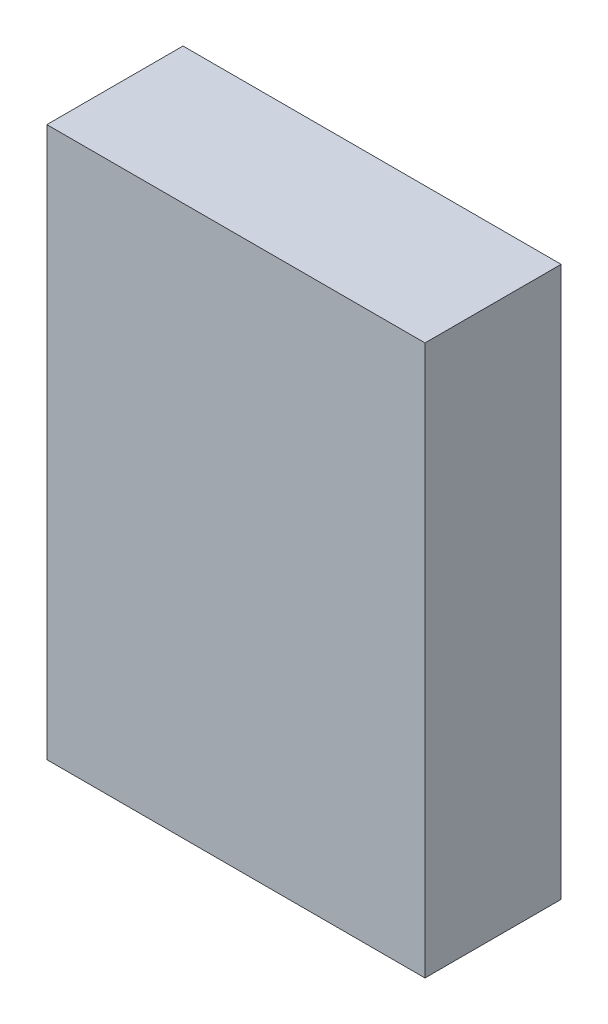
ISO-10303-21;
HEADER;
FILE_DESCRIPTION(('STEP AP214'),'2;1');
FILE_NAME('part.step','',(''),(''),'','','');
FILE_SCHEMA(('AUTOMOTIVE_DESIGN { 1 0 10303 214 1 1 1 1 }'));
ENDSEC;
DATA;
#1=APPLICATION_CONTEXT('core data for automotive mechanical design processes');
#2=APPLICATION_PROTOCOL_DEFINITION('international standard','automotive_design',2000,#1);
#3=PRODUCT_CONTEXT('',#1,'mechanical');
#4=PRODUCT('Part','Part','',(#3));
#5=PRODUCT_RELATED_PRODUCT_CATEGORY('part','',(#4));
#6=PRODUCT_DEFINITION_FORMATION('','',#4);
#7=PRODUCT_DEFINITION_CONTEXT('part definition',#1,'design');
#8=PRODUCT_DEFINITION('design','',#6,#7);
#9=PRODUCT_DEFINITION_SHAPE('','',#8);
#10=(LENGTH_UNIT() NAMED_UNIT(*) SI_UNIT(.MILLI.,.METRE.));
#11=(NAMED_UNIT(*) PLANE_ANGLE_UNIT() SI_UNIT($,.RADIAN.));
#12=(NAMED_UNIT(*) SI_UNIT($,.STERADIAN.) SOLID_ANGLE_UNIT());
#13=UNCERTAINTY_MEASURE_WITH_UNIT(LENGTH_MEASURE(1.E-05),#10,'distance_accuracy_value','');
#14=(GEOMETRIC_REPRESENTATION_CONTEXT(3) GLOBAL_UNCERTAINTY_ASSIGNED_CONTEXT((#13)) GLOBAL_UNIT_ASSIGNED_CONTEXT((#10,
#11,#12)) REPRESENTATION_CONTEXT('',''));
#15=CARTESIAN_POINT('',(0.,0.,0.));
#16=DIRECTION('',(0.,0.,1.));
#17=DIRECTION('',(1.,0.,0.));
#18=AXIS2_PLACEMENT_3D('',#15,#16,#17);
#19=CARTESIAN_POINT('',(55.,80.,-36.));
#20=DIRECTION('',(1.,0.,0.));
#21=DIRECTION('',(0.,1.,0.));
#22=AXIS2_PLACEMENT_3D('',#19,#20,#21);
#23=PLANE('',#22);
#24=DIRECTION('',(0.,0.,1.));
#25=VECTOR('',#24,1.);
#26=CARTESIAN_POINT('',(55.,80.,-36.));
#27=LINE('',#26,#25);
#28=CARTESIAN_POINT('',(55.,80.,-36.));
#29=VERTEX_POINT('',#28);
#30=CARTESIAN_POINT('',(55.,80.,3.6));
#31=VERTEX_POINT('',#30);
#32=EDGE_CURVE('E37',#29,#31,#27,.T.);
#33=ORIENTED_EDGE('',*,*,#32,.T.);
#34=DIRECTION('',(0.,1.,0.));
#35=VECTOR('',#34,1.);
#36=CARTESIAN_POINT('',(55.,80.,3.6));
#37=LINE('',#36,#35);
#38=CARTESIAN_POINT('',(55.,-80.,3.6));
#39=VERTEX_POINT('',#38);
#40=EDGE_CURVE('E127',#39,#31,#37,.T.);
#41=ORIENTED_EDGE('',*,*,#40,.F.);
#42=DIRECTION('',(0.,0.,1.));
#43=VECTOR('',#42,1.);
#44=CARTESIAN_POINT('',(55.,-80.,-36.));
#45=LINE('',#44,#43);
#46=CARTESIAN_POINT('',(55.,-80.,-36.));
#47=VERTEX_POINT('',#46);
#48=EDGE_CURVE('E11',#47,#39,#45,.T.);
#49=ORIENTED_EDGE('',*,*,#48,.F.);
#50=DIRECTION('',(0.,1.,0.));
#51=VECTOR('',#50,1.);
#52=CARTESIAN_POINT('',(55.,80.,-36.));
#53=LINE('',#52,#51);
#54=EDGE_CURVE('E148',#47,#29,#53,.T.);
#55=ORIENTED_EDGE('',*,*,#54,.T.);
#56=EDGE_LOOP('',(#33,#41,#49,#55));
#57=FACE_BOUND('',#56,.T.);
#58=ADVANCED_FACE('F34',(#57),#23,.T.);
#59=CARTESIAN_POINT('',(-55.,-80.,-36.));
#60=DIRECTION('',(0.,-1.,0.));
#61=DIRECTION('',(0.,0.,-1.));
#62=AXIS2_PLACEMENT_3D('',#59,#60,#61);
#63=PLANE('',#62);
#64=ORIENTED_EDGE('',*,*,#48,.T.);
#65=DIRECTION('',(1.,0.,0.));
#66=VECTOR('',#65,1.);
#67=CARTESIAN_POINT('',(-55.,-80.,3.6));
#68=LINE('',#67,#66);
#69=CARTESIAN_POINT('',(-55.,-80.,3.6));
#70=VERTEX_POINT('',#69);
#71=EDGE_CURVE('E145',#70,#39,#68,.T.);
#72=ORIENTED_EDGE('',*,*,#71,.F.);
#73=DIRECTION('',(0.,0.,1.));
#74=VECTOR('',#73,1.);
#75=CARTESIAN_POINT('',(-55.,-80.,-36.));
#76=LINE('',#75,#74);
#77=CARTESIAN_POINT('',(-55.,-80.,-36.));
#78=VERTEX_POINT('',#77);
#79=EDGE_CURVE('E43',#78,#70,#76,.T.);
#80=ORIENTED_EDGE('',*,*,#79,.F.);
#81=DIRECTION('',(1.,0.,0.));
#82=VECTOR('',#81,1.);
#83=CARTESIAN_POINT('',(-55.,-80.,-36.));
#84=LINE('',#83,#82);
#85=EDGE_CURVE('E157',#78,#47,#84,.T.);
#86=ORIENTED_EDGE('',*,*,#85,.T.);
#87=EDGE_LOOP('',(#64,#72,#80,#86));
#88=FACE_BOUND('',#87,.T.);
#89=ADVANCED_FACE('F173',(#88),#63,.T.);
#90=CARTESIAN_POINT('',(-55.,80.,-36.));
#91=DIRECTION('',(-1.,0.,0.));
#92=DIRECTION('',(0.,-1.,0.));
#93=AXIS2_PLACEMENT_3D('',#90,#91,#92);
#94=PLANE('',#93);
#95=ORIENTED_EDGE('',*,*,#79,.T.);
#96=DIRECTION('',(0.,-1.,0.));
#97=VECTOR('',#96,1.);
#98=CARTESIAN_POINT('',(-55.,80.,3.6));
#99=LINE('',#98,#97);
#100=CARTESIAN_POINT('',(-55.,80.,3.6));
#101=VERTEX_POINT('',#100);
#102=EDGE_CURVE('E142',#101,#70,#99,.T.);
#103=ORIENTED_EDGE('',*,*,#102,.F.);
#104=DIRECTION('',(0.,0.,1.));
#105=VECTOR('',#104,1.);
#106=CARTESIAN_POINT('',(-55.,80.,-36.));
#107=LINE('',#106,#105);
#108=CARTESIAN_POINT('',(-55.,80.,-36.));
#109=VERTEX_POINT('',#108);
#110=EDGE_CURVE('E160',#109,#101,#107,.T.);
#111=ORIENTED_EDGE('',*,*,#110,.F.);
#112=DIRECTION('',(0.,-1.,0.));
#113=VECTOR('',#112,1.);
#114=CARTESIAN_POINT('',(-55.,80.,-36.));
#115=LINE('',#114,#113);
#116=EDGE_CURVE('E154',#109,#78,#115,.T.);
#117=ORIENTED_EDGE('',*,*,#116,.T.);
#118=EDGE_LOOP('',(#95,#103,#111,#117));
#119=FACE_BOUND('',#118,.T.);
#120=ADVANCED_FACE('F179',(#119),#94,.T.);
#121=CARTESIAN_POINT('',(-55.,80.,-36.));
#122=DIRECTION('',(0.,1.,0.));
#123=DIRECTION('',(0.,0.,1.));
#124=AXIS2_PLACEMENT_3D('',#121,#122,#123);
#125=PLANE('',#124);
#126=ORIENTED_EDGE('',*,*,#110,.T.);
#127=DIRECTION('',(-1.,0.,0.));
#128=VECTOR('',#127,1.);
#129=CARTESIAN_POINT('',(-55.,80.,3.6));
#130=LINE('',#129,#128);
#131=EDGE_CURVE('E139',#31,#101,#130,.T.);
#132=ORIENTED_EDGE('',*,*,#131,.F.);
#133=ORIENTED_EDGE('',*,*,#32,.F.);
#134=DIRECTION('',(-1.,0.,0.));
#135=VECTOR('',#134,1.);
#136=CARTESIAN_POINT('',(-55.,80.,-36.));
#137=LINE('',#136,#135);
#138=EDGE_CURVE('E151',#29,#109,#137,.T.);
#139=ORIENTED_EDGE('',*,*,#138,.T.);
#140=EDGE_LOOP('',(#126,#132,#133,#139));
#141=FACE_BOUND('',#140,.T.);
#142=ADVANCED_FACE('F167',(#141),#125,.T.);
#143=CARTESIAN_POINT('',(0.,0.,-36.));
#144=DIRECTION('',(0.,0.,1.));
#145=DIRECTION('',(1.,0.,0.));
#146=AXIS2_PLACEMENT_3D('',#143,#144,#145);
#147=PLANE('',#146);
#148=ORIENTED_EDGE('',*,*,#54,.F.);
#149=ORIENTED_EDGE('',*,*,#85,.F.);
#150=ORIENTED_EDGE('',*,*,#116,.F.);
#151=ORIENTED_EDGE('',*,*,#138,.F.);
#152=EDGE_LOOP('',(#148,#149,#150,#151));
#153=FACE_BOUND('',#152,.T.);
#154=ADVANCED_FACE('F176',(#153),#147,.F.);
#155=CARTESIAN_POINT('',(0.,0.,3.6));
#156=DIRECTION('',(0.,0.,1.));
#157=DIRECTION('',(1.,0.,0.));
#158=AXIS2_PLACEMENT_3D('',#155,#156,#157);
#159=PLANE('',#158);
#160=ORIENTED_EDGE('',*,*,#40,.T.);
#161=ORIENTED_EDGE('',*,*,#131,.T.);
#162=ORIENTED_EDGE('',*,*,#102,.T.);
#163=ORIENTED_EDGE('',*,*,#71,.T.);
#164=EDGE_LOOP('',(#160,#161,#162,#163));
#165=FACE_BOUND('',#164,.T.);
#166=ADVANCED_FACE('F170',(#165),#159,.T.);
#167=CLOSED_SHELL('',(#58,#89,#120,#142,#154,#166));
#168=CARTESIAN_POINT('',(-55.,79.,3.602));
#169=DIRECTION('',(0.,1.,0.));
#170=DIRECTION('',(0.,0.,1.));
#171=AXIS2_PLACEMENT_3D('',#168,#169,#170);
#172=PLANE('',#171);
#173=DIRECTION('',(0.,0.,-1.));
#174=VECTOR('',#173,1.);
#175=CARTESIAN_POINT('',(54.,79.,3.602));
#176=LINE('',#175,#174);
#177=CARTESIAN_POINT('',(54.,79.,2.6));
#178=VERTEX_POINT('',#177);
#179=CARTESIAN_POINT('',(54.,79.,-35.));
#180=VERTEX_POINT('',#179);
#181=EDGE_CURVE('E59',#178,#180,#176,.T.);
#182=ORIENTED_EDGE('',*,*,#181,.F.);
#183=DIRECTION('',(1.,0.,0.));
#184=VECTOR('',#183,1.);
#185=CARTESIAN_POINT('',(-55.,79.,2.6));
#186=LINE('',#185,#184);
#187=CARTESIAN_POINT('',(-54.,79.,2.6));
#188=VERTEX_POINT('',#187);
#189=EDGE_CURVE('E106',#188,#178,#186,.T.);
#190=ORIENTED_EDGE('',*,*,#189,.F.);
#191=DIRECTION('',(0.,0.,1.));
#192=VECTOR('',#191,1.);
#193=CARTESIAN_POINT('',(-54.,79.,3.602));
#194=LINE('',#193,#192);
#195=CARTESIAN_POINT('',(-54.,79.,-35.));
#196=VERTEX_POINT('',#195);
#197=EDGE_CURVE('E115',#196,#188,#194,.T.);
#198=ORIENTED_EDGE('',*,*,#197,.F.);
#199=DIRECTION('',(1.,0.,0.));
#200=VECTOR('',#199,1.);
#201=CARTESIAN_POINT('',(-55.,79.,-35.));
#202=LINE('',#201,#200);
#203=EDGE_CURVE('E51',#196,#180,#202,.T.);
#204=ORIENTED_EDGE('',*,*,#203,.T.);
#205=EDGE_LOOP('',(#182,#190,#198,#204));
#206=FACE_BOUND('',#205,.T.);
#207=ADVANCED_FACE('F120',(#206),#172,.F.);
#208=CARTESIAN_POINT('',(-55.,-79.,-36.));
#209=DIRECTION('',(0.,-1.,0.));
#210=DIRECTION('',(0.,0.,-1.));
#211=AXIS2_PLACEMENT_3D('',#208,#209,#210);
#212=PLANE('',#211);
#213=DIRECTION('',(0.,0.,1.));
#214=VECTOR('',#213,1.);
#215=CARTESIAN_POINT('',(54.,-79.,-36.));
#216=LINE('',#215,#214);
#217=CARTESIAN_POINT('',(54.,-79.,-35.));
#218=VERTEX_POINT('',#217);
#219=CARTESIAN_POINT('',(54.,-79.,2.6));
#220=VERTEX_POINT('',#219);
#221=EDGE_CURVE('E125',#218,#220,#216,.T.);
#222=ORIENTED_EDGE('',*,*,#221,.F.);
#223=DIRECTION('',(1.,0.,0.));
#224=VECTOR('',#223,1.);
#225=CARTESIAN_POINT('',(0.,-79.,-35.));
#226=LINE('',#225,#224);
#227=CARTESIAN_POINT('',(-54.,-79.,-35.));
#228=VERTEX_POINT('',#227);
#229=EDGE_CURVE('E133',#228,#218,#226,.T.);
#230=ORIENTED_EDGE('',*,*,#229,.F.);
#231=DIRECTION('',(0.,0.,1.));
#232=VECTOR('',#231,1.);
#233=CARTESIAN_POINT('',(-54.,-79.,-36.));
#234=LINE('',#233,#232);
#235=CARTESIAN_POINT('',(-54.,-79.,2.6));
#236=VERTEX_POINT('',#235);
#237=EDGE_CURVE('E128',#228,#236,#234,.T.);
#238=ORIENTED_EDGE('',*,*,#237,.T.);
#239=DIRECTION('',(1.,0.,0.));
#240=VECTOR('',#239,1.);
#241=CARTESIAN_POINT('',(0.,-79.,2.6));
#242=LINE('',#241,#240);
#243=EDGE_CURVE('E108',#236,#220,#242,.T.);
#244=ORIENTED_EDGE('',*,*,#243,.T.);
#245=EDGE_LOOP('',(#222,#230,#238,#244));
#246=FACE_BOUND('',#245,.T.);
#247=ADVANCED_FACE('F222',(#246),#212,.F.);
#248=CARTESIAN_POINT('',(0.,0.,-35.));
#249=DIRECTION('',(0.,0.,1.));
#250=DIRECTION('',(1.,0.,0.));
#251=AXIS2_PLACEMENT_3D('',#248,#249,#250);
#252=PLANE('',#251);
#253=DIRECTION('',(0.,1.,0.));
#254=VECTOR('',#253,1.);
#255=CARTESIAN_POINT('',(54.,0.,-35.));
#256=LINE('',#255,#254);
#257=EDGE_CURVE('E129',#218,#180,#256,.T.);
#258=ORIENTED_EDGE('',*,*,#257,.T.);
#259=ORIENTED_EDGE('',*,*,#203,.F.);
#260=DIRECTION('',(0.,-1.,0.));
#261=VECTOR('',#260,1.);
#262=CARTESIAN_POINT('',(-54.,0.,-35.));
#263=LINE('',#262,#261);
#264=EDGE_CURVE('E117',#196,#228,#263,.T.);
#265=ORIENTED_EDGE('',*,*,#264,.T.);
#266=ORIENTED_EDGE('',*,*,#229,.T.);
#267=EDGE_LOOP('',(#258,#259,#265,#266));
#268=FACE_BOUND('',#267,.T.);
#269=ADVANCED_FACE('F226',(#268),#252,.T.);
#270=CARTESIAN_POINT('',(0.,0.,2.6));
#271=DIRECTION('',(0.,0.,1.));
#272=DIRECTION('',(1.,0.,0.));
#273=AXIS2_PLACEMENT_3D('',#270,#271,#272);
#274=PLANE('',#273);
#275=ORIENTED_EDGE('',*,*,#189,.T.);
#276=DIRECTION('',(0.,1.,0.));
#277=VECTOR('',#276,1.);
#278=CARTESIAN_POINT('',(54.,0.,2.6));
#279=LINE('',#278,#277);
#280=EDGE_CURVE('E112',#220,#178,#279,.T.);
#281=ORIENTED_EDGE('',*,*,#280,.F.);
#282=ORIENTED_EDGE('',*,*,#243,.F.);
#283=DIRECTION('',(0.,-1.,0.));
#284=VECTOR('',#283,1.);
#285=CARTESIAN_POINT('',(-54.,0.,2.6));
#286=LINE('',#285,#284);
#287=EDGE_CURVE('E101',#188,#236,#286,.T.);
#288=ORIENTED_EDGE('',*,*,#287,.F.);
#289=EDGE_LOOP('',(#275,#281,#282,#288));
#290=FACE_BOUND('',#289,.T.);
#291=ADVANCED_FACE('F103',(#290),#274,.F.);
#292=CARTESIAN_POINT('',(-54.,80.,-36.));
#293=DIRECTION('',(-1.,0.,0.));
#294=DIRECTION('',(0.,-1.,0.));
#295=AXIS2_PLACEMENT_3D('',#292,#293,#294);
#296=PLANE('',#295);
#297=ORIENTED_EDGE('',*,*,#197,.T.);
#298=ORIENTED_EDGE('',*,*,#287,.T.);
#299=ORIENTED_EDGE('',*,*,#237,.F.);
#300=ORIENTED_EDGE('',*,*,#264,.F.);
#301=EDGE_LOOP('',(#297,#298,#299,#300));
#302=FACE_BOUND('',#301,.T.);
#303=ADVANCED_FACE('F116',(#302),#296,.F.);
#304=CARTESIAN_POINT('',(54.,80.,-36.));
#305=DIRECTION('',(1.,0.,0.));
#306=DIRECTION('',(0.,1.,0.));
#307=AXIS2_PLACEMENT_3D('',#304,#305,#306);
#308=PLANE('',#307);
#309=ORIENTED_EDGE('',*,*,#181,.T.);
#310=ORIENTED_EDGE('',*,*,#257,.F.);
#311=ORIENTED_EDGE('',*,*,#221,.T.);
#312=ORIENTED_EDGE('',*,*,#280,.T.);
#313=EDGE_LOOP('',(#309,#310,#311,#312));
#314=FACE_BOUND('',#313,.T.);
#315=ADVANCED_FACE('F267',(#314),#308,.F.);
#316=CLOSED_SHELL('',(#207,#247,#269,#291,#303,#315));
#317=ORIENTED_CLOSED_SHELL('',*,#316,.T.);
#318=BREP_WITH_VOIDS('B2',#167,(#317));
#319=ADVANCED_BREP_SHAPE_REPRESENTATION('',(#18,#318),#14);
#320=SHAPE_DEFINITION_REPRESENTATION(#9,#319);
ENDSEC;
END-ISO-10303-21;
